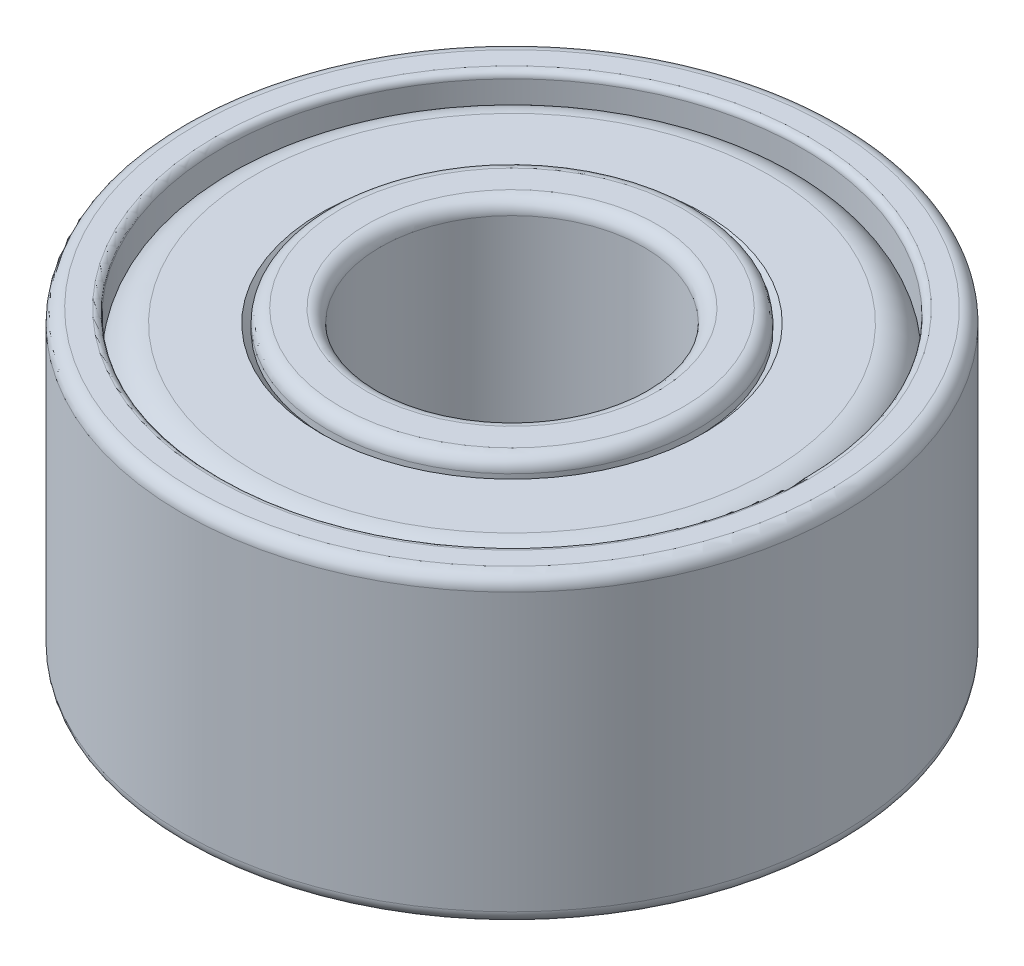
ISO-10303-21;
HEADER;
FILE_DESCRIPTION(('STEP AP214'),'2;1');
FILE_NAME('part.step','',(''),(''),'','','');
FILE_SCHEMA(('AUTOMOTIVE_DESIGN { 1 0 10303 214 1 1 1 1 }'));
ENDSEC;
DATA;
#1=APPLICATION_CONTEXT('core data for automotive mechanical design processes');
#2=APPLICATION_PROTOCOL_DEFINITION('international standard','automotive_design',2000,#1);
#3=PRODUCT_CONTEXT('',#1,'mechanical');
#4=PRODUCT('Part','Part','',(#3));
#5=PRODUCT_RELATED_PRODUCT_CATEGORY('part','',(#4));
#6=PRODUCT_DEFINITION_FORMATION('','',#4);
#7=PRODUCT_DEFINITION_CONTEXT('part definition',#1,'design');
#8=PRODUCT_DEFINITION('design','',#6,#7);
#9=PRODUCT_DEFINITION_SHAPE('','',#8);
#10=(LENGTH_UNIT() NAMED_UNIT(*) SI_UNIT(.MILLI.,.METRE.));
#11=(NAMED_UNIT(*) PLANE_ANGLE_UNIT() SI_UNIT($,.RADIAN.));
#12=(NAMED_UNIT(*) SI_UNIT($,.STERADIAN.) SOLID_ANGLE_UNIT());
#13=UNCERTAINTY_MEASURE_WITH_UNIT(LENGTH_MEASURE(1.E-05),#10,'distance_accuracy_value','');
#14=(GEOMETRIC_REPRESENTATION_CONTEXT(3) GLOBAL_UNCERTAINTY_ASSIGNED_CONTEXT((#13)) GLOBAL_UNIT_ASSIGNED_CONTEXT((#10,
#11,#12)) REPRESENTATION_CONTEXT('',''));
#15=CARTESIAN_POINT('',(0.,0.,0.));
#16=DIRECTION('',(0.,0.,1.));
#17=DIRECTION('',(1.,0.,0.));
#18=AXIS2_PLACEMENT_3D('',#15,#16,#17);
#19=CARTESIAN_POINT('',(0.,1.05,0.));
#20=DIRECTION('',(0.,1.,0.));
#21=DIRECTION('',(0.,0.,1.));
#22=AXIS2_PLACEMENT_3D('',#19,#20,#21);
#23=PLANE('',#22);
#24=CARTESIAN_POINT('',(0.,1.05,0.));
#25=DIRECTION('',(0.,1.,0.));
#26=DIRECTION('',(0.,0.,1.));
#27=AXIS2_PLACEMENT_3D('',#24,#25,#26);
#28=CIRCLE('',#27,1.45);
#29=CARTESIAN_POINT('',(0.,1.05,1.45));
#30=VERTEX_POINT('',#29);
#31=EDGE_CURVE('E11',#30,#30,#28,.F.);
#32=ORIENTED_EDGE('',*,*,#31,.T.);
#33=EDGE_LOOP('',(#32));
#34=FACE_BOUND('',#33,.T.);
#35=CARTESIAN_POINT('',(0.,1.05,0.));
#36=DIRECTION('',(0.,1.,0.));
#37=DIRECTION('',(0.,0.,1.));
#38=AXIS2_PLACEMENT_3D('',#35,#36,#37);
#39=CIRCLE('',#38,1.95);
#40=CARTESIAN_POINT('',(0.,1.05,1.95));
#41=VERTEX_POINT('',#40);
#42=EDGE_CURVE('E64',#41,#41,#39,.T.);
#43=ORIENTED_EDGE('',*,*,#42,.T.);
#44=EDGE_LOOP('',(#43));
#45=FACE_BOUND('',#44,.T.);
#46=ADVANCED_FACE('F44',(#34,#45),#23,.T.);
#47=CARTESIAN_POINT('',(0.,-1.05,0.));
#48=DIRECTION('',(0.,1.,0.));
#49=DIRECTION('',(0.,0.,1.));
#50=AXIS2_PLACEMENT_3D('',#47,#48,#49);
#51=PLANE('',#50);
#52=CARTESIAN_POINT('',(0.,-1.05,0.));
#53=DIRECTION('',(0.,1.,0.));
#54=DIRECTION('',(0.,0.,1.));
#55=AXIS2_PLACEMENT_3D('',#52,#53,#54);
#56=CIRCLE('',#55,1.45);
#57=CARTESIAN_POINT('',(0.,-1.05,1.45));
#58=VERTEX_POINT('',#57);
#59=EDGE_CURVE('E59',#58,#58,#56,.T.);
#60=ORIENTED_EDGE('',*,*,#59,.T.);
#61=EDGE_LOOP('',(#60));
#62=FACE_BOUND('',#61,.T.);
#63=CARTESIAN_POINT('',(0.,-1.05,0.));
#64=DIRECTION('',(0.,1.,0.));
#65=DIRECTION('',(0.,0.,1.));
#66=AXIS2_PLACEMENT_3D('',#63,#64,#65);
#67=CIRCLE('',#66,1.95);
#68=CARTESIAN_POINT('',(0.,-1.05,1.95));
#69=VERTEX_POINT('',#68);
#70=EDGE_CURVE('E67',#69,#69,#67,.F.);
#71=ORIENTED_EDGE('',*,*,#70,.T.);
#72=EDGE_LOOP('',(#71));
#73=FACE_BOUND('',#72,.T.);
#74=ADVANCED_FACE('F88',(#62,#73),#51,.F.);
#75=CARTESIAN_POINT('',(0.,1.05,0.));
#76=DIRECTION('',(0.,-1.,0.));
#77=DIRECTION('',(0.,0.,-1.));
#78=AXIS2_PLACEMENT_3D('',#75,#76,#77);
#79=CYLINDRICAL_SURFACE('',#78,2.2);
#80=CARTESIAN_POINT('',(0.,-0.8,0.));
#81=DIRECTION('',(0.,1.,0.));
#82=DIRECTION('',(0.,0.,1.));
#83=AXIS2_PLACEMENT_3D('',#80,#81,#82);
#84=CIRCLE('',#83,2.2);
#85=CARTESIAN_POINT('',(0.,-0.8,2.2));
#86=VERTEX_POINT('',#85);
#87=EDGE_CURVE('E70',#86,#86,#84,.T.);
#88=ORIENTED_EDGE('',*,*,#87,.T.);
#89=EDGE_LOOP('',(#88));
#90=FACE_BOUND('',#89,.T.);
#91=CARTESIAN_POINT('',(0.,0.8,0.));
#92=DIRECTION('',(0.,1.,0.));
#93=DIRECTION('',(0.,0.,1.));
#94=AXIS2_PLACEMENT_3D('',#91,#92,#93);
#95=CIRCLE('',#94,2.2);
#96=CARTESIAN_POINT('',(0.,0.8,2.2));
#97=VERTEX_POINT('',#96);
#98=EDGE_CURVE('E73',#97,#97,#95,.F.);
#99=ORIENTED_EDGE('',*,*,#98,.T.);
#100=EDGE_LOOP('',(#99));
#101=FACE_BOUND('',#100,.T.);
#102=ADVANCED_FACE('F77',(#90,#101),#79,.T.);
#103=CARTESIAN_POINT('',(0.,1.05,0.));
#104=DIRECTION('',(0.,-1.,0.));
#105=DIRECTION('',(0.,0.,-1.));
#106=AXIS2_PLACEMENT_3D('',#103,#104,#105);
#107=CYLINDRICAL_SURFACE('',#106,1.4);
#108=CARTESIAN_POINT('',(0.,-1.,0.));
#109=DIRECTION('',(0.,1.,0.));
#110=DIRECTION('',(0.,0.,1.));
#111=AXIS2_PLACEMENT_3D('',#108,#109,#110);
#112=CIRCLE('',#111,1.4);
#113=CARTESIAN_POINT('',(0.,-1.,1.4));
#114=VERTEX_POINT('',#113);
#115=EDGE_CURVE('E51',#114,#114,#112,.F.);
#116=ORIENTED_EDGE('',*,*,#115,.T.);
#117=EDGE_LOOP('',(#116));
#118=FACE_BOUND('',#117,.T.);
#119=CARTESIAN_POINT('',(0.,1.,0.));
#120=DIRECTION('',(0.,1.,0.));
#121=DIRECTION('',(0.,0.,1.));
#122=AXIS2_PLACEMENT_3D('',#119,#120,#121);
#123=CIRCLE('',#122,1.4);
#124=CARTESIAN_POINT('',(0.,1.,1.4));
#125=VERTEX_POINT('',#124);
#126=EDGE_CURVE('E55',#125,#125,#123,.T.);
#127=ORIENTED_EDGE('',*,*,#126,.T.);
#128=EDGE_LOOP('',(#127));
#129=FACE_BOUND('',#128,.T.);
#130=ADVANCED_FACE('F96',(#118,#129),#107,.F.);
#131=CARTESIAN_POINT('',(0.,-0.8,0.));
#132=DIRECTION('',(0.,1.,0.));
#133=DIRECTION('',(0.,0.,1.));
#134=AXIS2_PLACEMENT_3D('',#131,#132,#133);
#135=TOROIDAL_SURFACE('',#134,1.95,0.25);
#136=ORIENTED_EDGE('',*,*,#70,.F.);
#137=EDGE_LOOP('',(#136));
#138=FACE_BOUND('',#137,.T.);
#139=ORIENTED_EDGE('',*,*,#87,.F.);
#140=EDGE_LOOP('',(#139));
#141=FACE_BOUND('',#140,.T.);
#142=ADVANCED_FACE('F83',(#138,#141),#135,.T.);
#143=CARTESIAN_POINT('',(0.,0.8,0.));
#144=DIRECTION('',(0.,1.,0.));
#145=DIRECTION('',(0.,0.,1.));
#146=AXIS2_PLACEMENT_3D('',#143,#144,#145);
#147=TOROIDAL_SURFACE('',#146,1.95,0.25);
#148=ORIENTED_EDGE('',*,*,#98,.F.);
#149=EDGE_LOOP('',(#148));
#150=FACE_BOUND('',#149,.T.);
#151=ORIENTED_EDGE('',*,*,#42,.F.);
#152=EDGE_LOOP('',(#151));
#153=FACE_BOUND('',#152,.T.);
#154=ADVANCED_FACE('F79',(#150,#153),#147,.T.);
#155=CARTESIAN_POINT('',(0.,-1.05,0.));
#156=DIRECTION('',(0.,-1.,0.));
#157=DIRECTION('',(0.,0.,-1.));
#158=AXIS2_PLACEMENT_3D('',#155,#156,#157);
#159=CONICAL_SURFACE('',#158,1.45,0.785398163397448);
#160=ORIENTED_EDGE('',*,*,#115,.F.);
#161=EDGE_LOOP('',(#160));
#162=FACE_BOUND('',#161,.T.);
#163=ORIENTED_EDGE('',*,*,#59,.F.);
#164=EDGE_LOOP('',(#163));
#165=FACE_BOUND('',#164,.T.);
#166=ADVANCED_FACE('F82',(#162,#165),#159,.F.);
#167=CARTESIAN_POINT('',(0.,1.,0.));
#168=DIRECTION('',(0.,1.,0.));
#169=DIRECTION('',(0.,0.,1.));
#170=AXIS2_PLACEMENT_3D('',#167,#168,#169);
#171=CONICAL_SURFACE('',#170,1.4,0.785398163397442);
#172=ORIENTED_EDGE('',*,*,#31,.F.);
#173=EDGE_LOOP('',(#172));
#174=FACE_BOUND('',#173,.T.);
#175=ORIENTED_EDGE('',*,*,#126,.F.);
#176=EDGE_LOOP('',(#175));
#177=FACE_BOUND('',#176,.T.);
#178=ADVANCED_FACE('F46',(#174,#177),#171,.F.);
#179=CLOSED_SHELL('',(#46,#74,#102,#130,#142,#154,#166,#178));
#180=MANIFOLD_SOLID_BREP('B2',#179);
#181=CARTESIAN_POINT('',(0.,1.15,0.));
#182=DIRECTION('',(0.,1.,0.));
#183=DIRECTION('',(0.,0.,1.));
#184=AXIS2_PLACEMENT_3D('',#181,#182,#183);
#185=PLANE('',#184);
#186=CARTESIAN_POINT('',(0.,1.15,0.));
#187=DIRECTION('',(0.,1.,0.));
#188=DIRECTION('',(0.,0.,1.));
#189=AXIS2_PLACEMENT_3D('',#186,#187,#188);
#190=CIRCLE('',#189,2.25);
#191=CARTESIAN_POINT('',(0.,1.15,2.25));
#192=VERTEX_POINT('',#191);
#193=EDGE_CURVE('E43',#192,#192,#190,.F.);
#194=ORIENTED_EDGE('',*,*,#193,.T.);
#195=EDGE_LOOP('',(#194));
#196=FACE_BOUND('',#195,.T.);
#197=CARTESIAN_POINT('',(0.,1.15,0.));
#198=DIRECTION('',(0.,1.,0.));
#199=DIRECTION('',(0.,0.,1.));
#200=AXIS2_PLACEMENT_3D('',#197,#198,#199);
#201=CIRCLE('',#200,2.4);
#202=CARTESIAN_POINT('',(0.,1.15,2.4));
#203=VERTEX_POINT('',#202);
#204=EDGE_CURVE('E193',#203,#203,#201,.T.);
#205=ORIENTED_EDGE('',*,*,#204,.T.);
#206=EDGE_LOOP('',(#205));
#207=FACE_BOUND('',#206,.T.);
#208=ADVANCED_FACE('F173',(#196,#207),#185,.T.);
#209=CARTESIAN_POINT('',(0.,-1.15,0.));
#210=DIRECTION('',(0.,1.,0.));
#211=DIRECTION('',(0.,0.,1.));
#212=AXIS2_PLACEMENT_3D('',#209,#210,#211);
#213=PLANE('',#212);
#214=CARTESIAN_POINT('',(0.,-1.15,0.));
#215=DIRECTION('',(0.,1.,0.));
#216=DIRECTION('',(0.,0.,1.));
#217=AXIS2_PLACEMENT_3D('',#214,#215,#216);
#218=CIRCLE('',#217,2.25);
#219=CARTESIAN_POINT('',(0.,-1.15,2.25));
#220=VERTEX_POINT('',#219);
#221=EDGE_CURVE('E188',#220,#220,#218,.T.);
#222=ORIENTED_EDGE('',*,*,#221,.T.);
#223=EDGE_LOOP('',(#222));
#224=FACE_BOUND('',#223,.T.);
#225=CARTESIAN_POINT('',(0.,-1.15,0.));
#226=DIRECTION('',(0.,1.,0.));
#227=DIRECTION('',(0.,0.,1.));
#228=AXIS2_PLACEMENT_3D('',#225,#226,#227);
#229=CIRCLE('',#228,2.4);
#230=CARTESIAN_POINT('',(0.,-1.15,2.4));
#231=VERTEX_POINT('',#230);
#232=EDGE_CURVE('E196',#231,#231,#229,.F.);
#233=ORIENTED_EDGE('',*,*,#232,.T.);
#234=EDGE_LOOP('',(#233));
#235=FACE_BOUND('',#234,.T.);
#236=ADVANCED_FACE('F217',(#224,#235),#213,.F.);
#237=CARTESIAN_POINT('',(0.,1.15,0.));
#238=DIRECTION('',(0.,-1.,0.));
#239=DIRECTION('',(0.,0.,-1.));
#240=AXIS2_PLACEMENT_3D('',#237,#238,#239);
#241=CYLINDRICAL_SURFACE('',#240,2.5);
#242=CARTESIAN_POINT('',(0.,-1.05,0.));
#243=DIRECTION('',(0.,1.,0.));
#244=DIRECTION('',(0.,0.,1.));
#245=AXIS2_PLACEMENT_3D('',#242,#243,#244);
#246=CIRCLE('',#245,2.5);
#247=CARTESIAN_POINT('',(0.,-1.05,2.5));
#248=VERTEX_POINT('',#247);
#249=EDGE_CURVE('E199',#248,#248,#246,.T.);
#250=ORIENTED_EDGE('',*,*,#249,.T.);
#251=EDGE_LOOP('',(#250));
#252=FACE_BOUND('',#251,.T.);
#253=CARTESIAN_POINT('',(0.,1.05,0.));
#254=DIRECTION('',(0.,1.,0.));
#255=DIRECTION('',(0.,0.,1.));
#256=AXIS2_PLACEMENT_3D('',#253,#254,#255);
#257=CIRCLE('',#256,2.5);
#258=CARTESIAN_POINT('',(0.,1.05,2.5));
#259=VERTEX_POINT('',#258);
#260=EDGE_CURVE('E202',#259,#259,#257,.F.);
#261=ORIENTED_EDGE('',*,*,#260,.T.);
#262=EDGE_LOOP('',(#261));
#263=FACE_BOUND('',#262,.T.);
#264=ADVANCED_FACE('F206',(#252,#263),#241,.T.);
#265=CARTESIAN_POINT('',(0.,1.15,0.));
#266=DIRECTION('',(0.,-1.,0.));
#267=DIRECTION('',(0.,0.,-1.));
#268=AXIS2_PLACEMENT_3D('',#265,#266,#267);
#269=CYLINDRICAL_SURFACE('',#268,2.2);
#270=CARTESIAN_POINT('',(0.,-1.1,0.));
#271=DIRECTION('',(0.,1.,0.));
#272=DIRECTION('',(0.,0.,1.));
#273=AXIS2_PLACEMENT_3D('',#270,#271,#272);
#274=CIRCLE('',#273,2.2);
#275=CARTESIAN_POINT('',(0.,-1.1,2.2));
#276=VERTEX_POINT('',#275);
#277=EDGE_CURVE('E180',#276,#276,#274,.F.);
#278=ORIENTED_EDGE('',*,*,#277,.T.);
#279=EDGE_LOOP('',(#278));
#280=FACE_BOUND('',#279,.T.);
#281=CARTESIAN_POINT('',(0.,1.1,0.));
#282=DIRECTION('',(0.,1.,0.));
#283=DIRECTION('',(0.,0.,1.));
#284=AXIS2_PLACEMENT_3D('',#281,#282,#283);
#285=CIRCLE('',#284,2.2);
#286=CARTESIAN_POINT('',(0.,1.1,2.2));
#287=VERTEX_POINT('',#286);
#288=EDGE_CURVE('E184',#287,#287,#285,.T.);
#289=ORIENTED_EDGE('',*,*,#288,.T.);
#290=EDGE_LOOP('',(#289));
#291=FACE_BOUND('',#290,.T.);
#292=ADVANCED_FACE('F225',(#280,#291),#269,.F.);
#293=CARTESIAN_POINT('',(0.,-1.05,0.));
#294=DIRECTION('',(0.,1.,0.));
#295=DIRECTION('',(0.,0.,1.));
#296=AXIS2_PLACEMENT_3D('',#293,#294,#295);
#297=TOROIDAL_SURFACE('',#296,2.4,0.1);
#298=ORIENTED_EDGE('',*,*,#232,.F.);
#299=EDGE_LOOP('',(#298));
#300=FACE_BOUND('',#299,.T.);
#301=ORIENTED_EDGE('',*,*,#249,.F.);
#302=EDGE_LOOP('',(#301));
#303=FACE_BOUND('',#302,.T.);
#304=ADVANCED_FACE('F212',(#300,#303),#297,.T.);
#305=CARTESIAN_POINT('',(0.,1.05,0.));
#306=DIRECTION('',(0.,1.,0.));
#307=DIRECTION('',(0.,0.,1.));
#308=AXIS2_PLACEMENT_3D('',#305,#306,#307);
#309=TOROIDAL_SURFACE('',#308,2.4,0.1);
#310=ORIENTED_EDGE('',*,*,#260,.F.);
#311=EDGE_LOOP('',(#310));
#312=FACE_BOUND('',#311,.T.);
#313=ORIENTED_EDGE('',*,*,#204,.F.);
#314=EDGE_LOOP('',(#313));
#315=FACE_BOUND('',#314,.T.);
#316=ADVANCED_FACE('F208',(#312,#315),#309,.T.);
#317=CARTESIAN_POINT('',(0.,-1.1,0.));
#318=DIRECTION('',(0.,1.,0.));
#319=DIRECTION('',(0.,0.,1.));
#320=AXIS2_PLACEMENT_3D('',#317,#318,#319);
#321=TOROIDAL_SURFACE('',#320,2.25,0.05);
#322=ORIENTED_EDGE('',*,*,#277,.F.);
#323=EDGE_LOOP('',(#322));
#324=FACE_BOUND('',#323,.T.);
#325=ORIENTED_EDGE('',*,*,#221,.F.);
#326=EDGE_LOOP('',(#325));
#327=FACE_BOUND('',#326,.T.);
#328=ADVANCED_FACE('F211',(#324,#327),#321,.T.);
#329=CARTESIAN_POINT('',(0.,1.1,0.));
#330=DIRECTION('',(0.,1.,0.));
#331=DIRECTION('',(0.,0.,1.));
#332=AXIS2_PLACEMENT_3D('',#329,#330,#331);
#333=TOROIDAL_SURFACE('',#332,2.25,0.05);
#334=ORIENTED_EDGE('',*,*,#193,.F.);
#335=EDGE_LOOP('',(#334));
#336=FACE_BOUND('',#335,.T.);
#337=ORIENTED_EDGE('',*,*,#288,.F.);
#338=EDGE_LOOP('',(#337));
#339=FACE_BOUND('',#338,.T.);
#340=ADVANCED_FACE('F175',(#336,#339),#333,.T.);
#341=CLOSED_SHELL('',(#208,#236,#264,#292,#304,#316,#328,#340));
#342=MANIFOLD_SOLID_BREP('B6',#341);
#343=CARTESIAN_POINT('',(0.,1.15,0.));
#344=DIRECTION('',(0.,1.,0.));
#345=DIRECTION('',(0.,0.,1.));
#346=AXIS2_PLACEMENT_3D('',#343,#344,#345);
#347=PLANE('',#346);
#348=CARTESIAN_POINT('',(0.,1.15,0.));
#349=DIRECTION('',(0.,1.,0.));
#350=DIRECTION('',(0.,0.,1.));
#351=AXIS2_PLACEMENT_3D('',#348,#349,#350);
#352=CIRCLE('',#351,1.1);
#353=CARTESIAN_POINT('',(0.,1.15,1.1));
#354=VERTEX_POINT('',#353);
#355=EDGE_CURVE('E172',#354,#354,#352,.F.);
#356=ORIENTED_EDGE('',*,*,#355,.T.);
#357=EDGE_LOOP('',(#356));
#358=FACE_BOUND('',#357,.T.);
#359=CARTESIAN_POINT('',(0.,1.15,0.));
#360=DIRECTION('',(0.,1.,0.));
#361=DIRECTION('',(0.,0.,1.));
#362=AXIS2_PLACEMENT_3D('',#359,#360,#361);
#363=CIRCLE('',#362,1.3);
#364=CARTESIAN_POINT('',(0.,1.15,1.3));
#365=VERTEX_POINT('',#364);
#366=EDGE_CURVE('E302',#365,#365,#363,.T.);
#367=ORIENTED_EDGE('',*,*,#366,.T.);
#368=EDGE_LOOP('',(#367));
#369=FACE_BOUND('',#368,.T.);
#370=ADVANCED_FACE('F295',(#358,#369),#347,.T.);
#371=CARTESIAN_POINT('',(0.,-1.15,0.));
#372=DIRECTION('',(0.,1.,0.));
#373=DIRECTION('',(0.,0.,1.));
#374=AXIS2_PLACEMENT_3D('',#371,#372,#373);
#375=PLANE('',#374);
#376=CARTESIAN_POINT('',(0.,-1.15,0.));
#377=DIRECTION('',(0.,1.,0.));
#378=DIRECTION('',(0.,0.,1.));
#379=AXIS2_PLACEMENT_3D('',#376,#377,#378);
#380=CIRCLE('',#379,1.1);
#381=CARTESIAN_POINT('',(0.,-1.15,1.1));
#382=VERTEX_POINT('',#381);
#383=EDGE_CURVE('E321',#382,#382,#380,.T.);
#384=ORIENTED_EDGE('',*,*,#383,.T.);
#385=EDGE_LOOP('',(#384));
#386=FACE_BOUND('',#385,.T.);
#387=CARTESIAN_POINT('',(0.,-1.15,0.));
#388=DIRECTION('',(0.,1.,0.));
#389=DIRECTION('',(0.,0.,1.));
#390=AXIS2_PLACEMENT_3D('',#387,#388,#389);
#391=CIRCLE('',#390,1.3);
#392=CARTESIAN_POINT('',(0.,-1.15,1.3));
#393=VERTEX_POINT('',#392);
#394=EDGE_CURVE('E324',#393,#393,#391,.F.);
#395=ORIENTED_EDGE('',*,*,#394,.T.);
#396=EDGE_LOOP('',(#395));
#397=FACE_BOUND('',#396,.T.);
#398=ADVANCED_FACE('F328',(#386,#397),#375,.F.);
#399=CARTESIAN_POINT('',(0.,1.15,0.));
#400=DIRECTION('',(0.,-1.,0.));
#401=DIRECTION('',(0.,0.,-1.));
#402=AXIS2_PLACEMENT_3D('',#399,#400,#401);
#403=CYLINDRICAL_SURFACE('',#402,1.4);
#404=CARTESIAN_POINT('',(0.,-1.05,0.));
#405=DIRECTION('',(0.,1.,0.));
#406=DIRECTION('',(0.,0.,1.));
#407=AXIS2_PLACEMENT_3D('',#404,#405,#406);
#408=CIRCLE('',#407,1.4);
#409=CARTESIAN_POINT('',(0.,-1.05,1.4));
#410=VERTEX_POINT('',#409);
#411=EDGE_CURVE('E306',#410,#410,#408,.T.);
#412=ORIENTED_EDGE('',*,*,#411,.T.);
#413=EDGE_LOOP('',(#412));
#414=FACE_BOUND('',#413,.T.);
#415=CARTESIAN_POINT('',(0.,1.05,0.));
#416=DIRECTION('',(0.,1.,0.));
#417=DIRECTION('',(0.,0.,1.));
#418=AXIS2_PLACEMENT_3D('',#415,#416,#417);
#419=CIRCLE('',#418,1.4);
#420=CARTESIAN_POINT('',(0.,1.05,1.4));
#421=VERTEX_POINT('',#420);
#422=EDGE_CURVE('E310',#421,#421,#419,.F.);
#423=ORIENTED_EDGE('',*,*,#422,.T.);
#424=EDGE_LOOP('',(#423));
#425=FACE_BOUND('',#424,.T.);
#426=ADVANCED_FACE('F338',(#414,#425),#403,.T.);
#427=CARTESIAN_POINT('',(0.,1.15,0.));
#428=DIRECTION('',(0.,-1.,0.));
#429=DIRECTION('',(0.,0.,-1.));
#430=AXIS2_PLACEMENT_3D('',#427,#428,#429);
#431=CYLINDRICAL_SURFACE('',#430,1.);
#432=CARTESIAN_POINT('',(0.,-1.05,0.));
#433=DIRECTION('',(0.,1.,0.));
#434=DIRECTION('',(0.,0.,1.));
#435=AXIS2_PLACEMENT_3D('',#432,#433,#434);
#436=CIRCLE('',#435,1.);
#437=CARTESIAN_POINT('',(0.,-1.05,1.));
#438=VERTEX_POINT('',#437);
#439=EDGE_CURVE('E315',#438,#438,#436,.F.);
#440=ORIENTED_EDGE('',*,*,#439,.T.);
#441=EDGE_LOOP('',(#440));
#442=FACE_BOUND('',#441,.T.);
#443=CARTESIAN_POINT('',(0.,1.05,0.));
#444=DIRECTION('',(0.,1.,0.));
#445=DIRECTION('',(0.,0.,1.));
#446=AXIS2_PLACEMENT_3D('',#443,#444,#445);
#447=CIRCLE('',#446,1.);
#448=CARTESIAN_POINT('',(0.,1.05,1.));
#449=VERTEX_POINT('',#448);
#450=EDGE_CURVE('E318',#449,#449,#447,.T.);
#451=ORIENTED_EDGE('',*,*,#450,.T.);
#452=EDGE_LOOP('',(#451));
#453=FACE_BOUND('',#452,.T.);
#454=ADVANCED_FACE('F341',(#442,#453),#431,.F.);
#455=CARTESIAN_POINT('',(0.,-1.05,0.));
#456=DIRECTION('',(0.,1.,0.));
#457=DIRECTION('',(0.,0.,1.));
#458=AXIS2_PLACEMENT_3D('',#455,#456,#457);
#459=TOROIDAL_SURFACE('',#458,1.1,0.1);
#460=ORIENTED_EDGE('',*,*,#439,.F.);
#461=EDGE_LOOP('',(#460));
#462=FACE_BOUND('',#461,.T.);
#463=ORIENTED_EDGE('',*,*,#383,.F.);
#464=EDGE_LOOP('',(#463));
#465=FACE_BOUND('',#464,.T.);
#466=ADVANCED_FACE('F334',(#462,#465),#459,.T.);
#467=CARTESIAN_POINT('',(0.,-1.05,0.));
#468=DIRECTION('',(0.,1.,0.));
#469=DIRECTION('',(0.,0.,1.));
#470=AXIS2_PLACEMENT_3D('',#467,#468,#469);
#471=TOROIDAL_SURFACE('',#470,1.3,0.1);
#472=ORIENTED_EDGE('',*,*,#394,.F.);
#473=EDGE_LOOP('',(#472));
#474=FACE_BOUND('',#473,.T.);
#475=ORIENTED_EDGE('',*,*,#411,.F.);
#476=EDGE_LOOP('',(#475));
#477=FACE_BOUND('',#476,.T.);
#478=ADVANCED_FACE('F330',(#474,#477),#471,.T.);
#479=CARTESIAN_POINT('',(0.,1.05,0.));
#480=DIRECTION('',(0.,1.,0.));
#481=DIRECTION('',(0.,0.,1.));
#482=AXIS2_PLACEMENT_3D('',#479,#480,#481);
#483=TOROIDAL_SURFACE('',#482,1.1,0.1);
#484=ORIENTED_EDGE('',*,*,#355,.F.);
#485=EDGE_LOOP('',(#484));
#486=FACE_BOUND('',#485,.T.);
#487=ORIENTED_EDGE('',*,*,#450,.F.);
#488=EDGE_LOOP('',(#487));
#489=FACE_BOUND('',#488,.T.);
#490=ADVANCED_FACE('F333',(#486,#489),#483,.T.);
#491=CARTESIAN_POINT('',(0.,1.05,0.));
#492=DIRECTION('',(0.,1.,0.));
#493=DIRECTION('',(0.,0.,1.));
#494=AXIS2_PLACEMENT_3D('',#491,#492,#493);
#495=TOROIDAL_SURFACE('',#494,1.3,0.1);
#496=ORIENTED_EDGE('',*,*,#422,.F.);
#497=EDGE_LOOP('',(#496));
#498=FACE_BOUND('',#497,.T.);
#499=ORIENTED_EDGE('',*,*,#366,.F.);
#500=EDGE_LOOP('',(#499));
#501=FACE_BOUND('',#500,.T.);
#502=ADVANCED_FACE('F297',(#498,#501),#495,.T.);
#503=CLOSED_SHELL('',(#370,#398,#426,#454,#466,#478,#490,#502));
#504=MANIFOLD_SOLID_BREP('B38',#503);
#505=ADVANCED_BREP_SHAPE_REPRESENTATION('',(#18,#180,#342,#504),#14);
#506=SHAPE_DEFINITION_REPRESENTATION(#9,#505);
ENDSEC;
END-ISO-10303-21;
